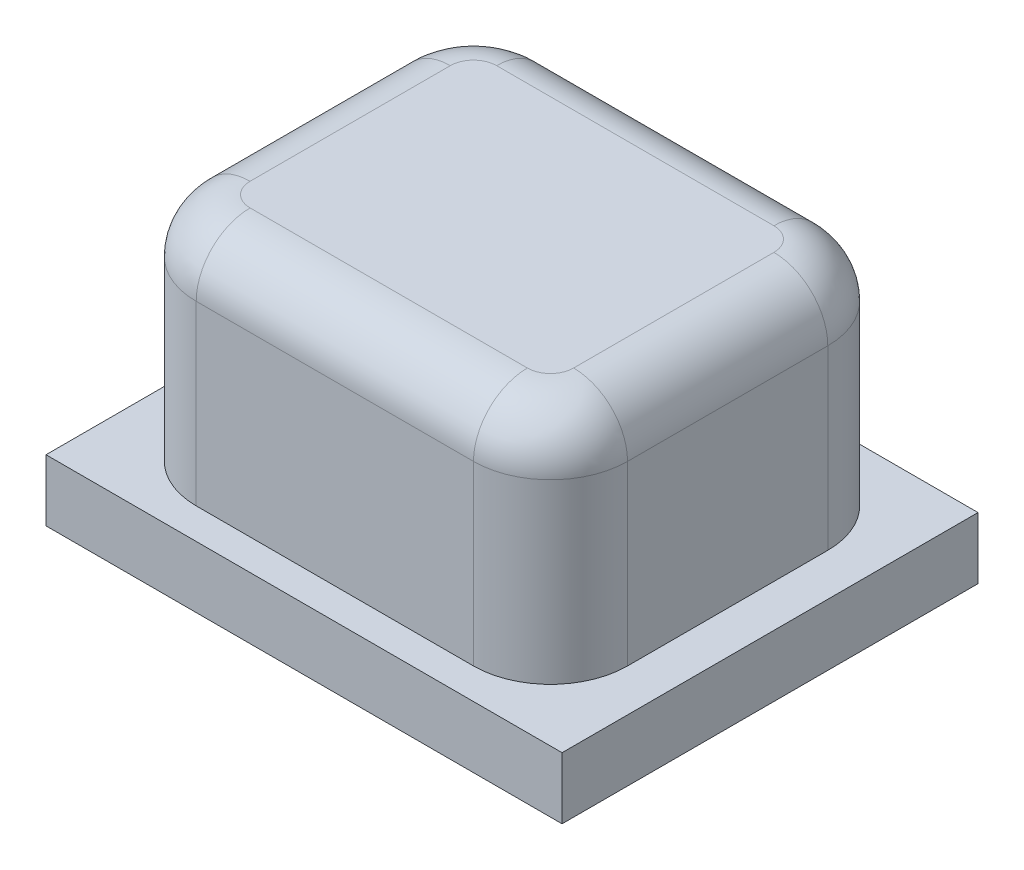
ISO-10303-21;
HEADER;
FILE_DESCRIPTION(('STEP AP214'),'2;1');
FILE_NAME('part.step','',(''),(''),'','','');
FILE_SCHEMA(('AUTOMOTIVE_DESIGN { 1 0 10303 214 1 1 1 1 }'));
ENDSEC;
DATA;
#1=APPLICATION_CONTEXT('core data for automotive mechanical design processes');
#2=APPLICATION_PROTOCOL_DEFINITION('international standard','automotive_design',2000,#1);
#3=PRODUCT_CONTEXT('',#1,'mechanical');
#4=PRODUCT('Part','Part','',(#3));
#5=PRODUCT_RELATED_PRODUCT_CATEGORY('part','',(#4));
#6=PRODUCT_DEFINITION_FORMATION('','',#4);
#7=PRODUCT_DEFINITION_CONTEXT('part definition',#1,'design');
#8=PRODUCT_DEFINITION('design','',#6,#7);
#9=PRODUCT_DEFINITION_SHAPE('','',#8);
#10=(LENGTH_UNIT() NAMED_UNIT(*) SI_UNIT(.MILLI.,.METRE.));
#11=(NAMED_UNIT(*) PLANE_ANGLE_UNIT() SI_UNIT($,.RADIAN.));
#12=(NAMED_UNIT(*) SI_UNIT($,.STERADIAN.) SOLID_ANGLE_UNIT());
#13=UNCERTAINTY_MEASURE_WITH_UNIT(LENGTH_MEASURE(1.E-05),#10,'distance_accuracy_value','');
#14=(GEOMETRIC_REPRESENTATION_CONTEXT(3) GLOBAL_UNCERTAINTY_ASSIGNED_CONTEXT((#13)) GLOBAL_UNIT_ASSIGNED_CONTEXT((#10,
#11,#12)) REPRESENTATION_CONTEXT('',''));
#15=CARTESIAN_POINT('',(0.,0.,0.));
#16=DIRECTION('',(0.,0.,1.));
#17=DIRECTION('',(1.,0.,0.));
#18=AXIS2_PLACEMENT_3D('',#15,#16,#17);
#19=CARTESIAN_POINT('',(1.8,3.,1.3));
#20=DIRECTION('',(0.,-1.,0.));
#21=DIRECTION('',(0.,0.,-1.));
#22=AXIS2_PLACEMENT_3D('',#19,#20,#21);
#23=CYLINDRICAL_SURFACE('',#22,1.);
#24=DIRECTION('',(0.,-1.,0.));
#25=VECTOR('',#24,1.);
#26=CARTESIAN_POINT('',(2.8,3.,1.3));
#27=LINE('',#26,#25);
#28=CARTESIAN_POINT('',(2.8,2.3,1.3));
#29=VERTEX_POINT('',#28);
#30=CARTESIAN_POINT('',(2.8,0.,1.3));
#31=VERTEX_POINT('',#30);
#32=EDGE_CURVE('E281',#29,#31,#27,.T.);
#33=ORIENTED_EDGE('',*,*,#32,.F.);
#34=CARTESIAN_POINT('',(1.8,2.3,1.3));
#35=DIRECTION('',(0.,1.,0.));
#36=DIRECTION('',(0.,0.,1.));
#37=AXIS2_PLACEMENT_3D('',#34,#35,#36);
#38=CIRCLE('',#37,1.);
#39=CARTESIAN_POINT('',(1.8,2.3,2.3));
#40=VERTEX_POINT('',#39);
#41=EDGE_CURVE('E305',#29,#40,#38,.F.);
#42=ORIENTED_EDGE('',*,*,#41,.T.);
#43=DIRECTION('',(0.,-1.,0.));
#44=VECTOR('',#43,1.);
#45=CARTESIAN_POINT('',(1.8,3.,2.3));
#46=LINE('',#45,#44);
#47=CARTESIAN_POINT('',(1.8,0.,2.3));
#48=VERTEX_POINT('',#47);
#49=EDGE_CURVE('E267',#40,#48,#46,.T.);
#50=ORIENTED_EDGE('',*,*,#49,.T.);
#51=CARTESIAN_POINT('',(1.8,0.,1.3));
#52=DIRECTION('',(0.,1.,0.));
#53=DIRECTION('',(0.,0.,1.));
#54=AXIS2_PLACEMENT_3D('',#51,#52,#53);
#55=CIRCLE('',#54,1.);
#56=EDGE_CURVE('E243',#48,#31,#55,.T.);
#57=ORIENTED_EDGE('',*,*,#56,.T.);
#58=EDGE_LOOP('',(#33,#42,#50,#57));
#59=FACE_BOUND('',#58,.T.);
#60=ADVANCED_FACE('F33',(#59),#23,.T.);
#61=CARTESIAN_POINT('',(2.8,3.,1.3));
#62=DIRECTION('',(-1.,0.,0.));
#63=DIRECTION('',(0.,0.,1.));
#64=AXIS2_PLACEMENT_3D('',#61,#62,#63);
#65=PLANE('',#64);
#66=DIRECTION('',(0.,-1.,0.));
#67=VECTOR('',#66,1.);
#68=CARTESIAN_POINT('',(2.8,3.,-1.3));
#69=LINE('',#68,#67);
#70=CARTESIAN_POINT('',(2.8,2.3,-1.3));
#71=VERTEX_POINT('',#70);
#72=CARTESIAN_POINT('',(2.8,0.,-1.3));
#73=VERTEX_POINT('',#72);
#74=EDGE_CURVE('E279',#71,#73,#69,.T.);
#75=ORIENTED_EDGE('',*,*,#74,.F.);
#76=DIRECTION('',(0.,0.,-1.));
#77=VECTOR('',#76,1.);
#78=CARTESIAN_POINT('',(2.8,2.3,1.3));
#79=LINE('',#78,#77);
#80=EDGE_CURVE('E303',#71,#29,#79,.F.);
#81=ORIENTED_EDGE('',*,*,#80,.T.);
#82=ORIENTED_EDGE('',*,*,#32,.T.);
#83=DIRECTION('',(0.,0.,-1.));
#84=VECTOR('',#83,1.);
#85=CARTESIAN_POINT('',(2.8,0.,1.3));
#86=LINE('',#85,#84);
#87=EDGE_CURVE('E246',#31,#73,#86,.T.);
#88=ORIENTED_EDGE('',*,*,#87,.T.);
#89=EDGE_LOOP('',(#75,#81,#82,#88));
#90=FACE_BOUND('',#89,.T.);
#91=ADVANCED_FACE('F380',(#90),#65,.F.);
#92=CARTESIAN_POINT('',(1.8,3.,-1.3));
#93=DIRECTION('',(0.,-1.,0.));
#94=DIRECTION('',(0.,0.,-1.));
#95=AXIS2_PLACEMENT_3D('',#92,#93,#94);
#96=CYLINDRICAL_SURFACE('',#95,1.);
#97=DIRECTION('',(0.,-1.,0.));
#98=VECTOR('',#97,1.);
#99=CARTESIAN_POINT('',(1.8,3.,-2.3));
#100=LINE('',#99,#98);
#101=CARTESIAN_POINT('',(1.8,2.3,-2.3));
#102=VERTEX_POINT('',#101);
#103=CARTESIAN_POINT('',(1.8,0.,-2.3));
#104=VERTEX_POINT('',#103);
#105=EDGE_CURVE('E277',#102,#104,#100,.T.);
#106=ORIENTED_EDGE('',*,*,#105,.F.);
#107=CARTESIAN_POINT('',(1.8,2.3,-1.3));
#108=DIRECTION('',(0.,1.,0.));
#109=DIRECTION('',(0.,0.,1.));
#110=AXIS2_PLACEMENT_3D('',#107,#108,#109);
#111=CIRCLE('',#110,1.);
#112=EDGE_CURVE('E300',#102,#71,#111,.F.);
#113=ORIENTED_EDGE('',*,*,#112,.T.);
#114=ORIENTED_EDGE('',*,*,#74,.T.);
#115=CARTESIAN_POINT('',(1.8,0.,-1.3));
#116=DIRECTION('',(0.,1.,0.));
#117=DIRECTION('',(0.,0.,-1.));
#118=AXIS2_PLACEMENT_3D('',#115,#116,#117);
#119=CIRCLE('',#118,1.);
#120=EDGE_CURVE('E249',#73,#104,#119,.T.);
#121=ORIENTED_EDGE('',*,*,#120,.T.);
#122=EDGE_LOOP('',(#106,#113,#114,#121));
#123=FACE_BOUND('',#122,.T.);
#124=ADVANCED_FACE('F377',(#123),#96,.T.);
#125=CARTESIAN_POINT('',(-1.8,3.,-2.3));
#126=DIRECTION('',(0.,0.,1.));
#127=DIRECTION('',(1.,0.,0.));
#128=AXIS2_PLACEMENT_3D('',#125,#126,#127);
#129=PLANE('',#128);
#130=DIRECTION('',(0.,-1.,0.));
#131=VECTOR('',#130,1.);
#132=CARTESIAN_POINT('',(-1.8,3.,-2.3));
#133=LINE('',#132,#131);
#134=CARTESIAN_POINT('',(-1.8,2.3,-2.3));
#135=VERTEX_POINT('',#134);
#136=CARTESIAN_POINT('',(-1.8,0.,-2.3));
#137=VERTEX_POINT('',#136);
#138=EDGE_CURVE('E275',#135,#137,#133,.T.);
#139=ORIENTED_EDGE('',*,*,#138,.F.);
#140=DIRECTION('',(-1.,0.,0.));
#141=VECTOR('',#140,1.);
#142=CARTESIAN_POINT('',(1.8,2.3,-2.3));
#143=LINE('',#142,#141);
#144=EDGE_CURVE('E11',#135,#102,#143,.F.);
#145=ORIENTED_EDGE('',*,*,#144,.T.);
#146=ORIENTED_EDGE('',*,*,#105,.T.);
#147=DIRECTION('',(-1.,0.,0.));
#148=VECTOR('',#147,1.);
#149=CARTESIAN_POINT('',(-1.8,0.,-2.3));
#150=LINE('',#149,#148);
#151=EDGE_CURVE('E252',#104,#137,#150,.T.);
#152=ORIENTED_EDGE('',*,*,#151,.T.);
#153=EDGE_LOOP('',(#139,#145,#146,#152));
#154=FACE_BOUND('',#153,.T.);
#155=ADVANCED_FACE('F359',(#154),#129,.F.);
#156=CARTESIAN_POINT('',(-1.8,3.,-1.3));
#157=DIRECTION('',(0.,-1.,0.));
#158=DIRECTION('',(0.,0.,-1.));
#159=AXIS2_PLACEMENT_3D('',#156,#157,#158);
#160=CYLINDRICAL_SURFACE('',#159,1.);
#161=DIRECTION('',(0.,-1.,0.));
#162=VECTOR('',#161,1.);
#163=CARTESIAN_POINT('',(-2.8,3.,-1.3));
#164=LINE('',#163,#162);
#165=CARTESIAN_POINT('',(-2.8,2.3,-1.3));
#166=VERTEX_POINT('',#165);
#167=CARTESIAN_POINT('',(-2.8,0.,-1.3));
#168=VERTEX_POINT('',#167);
#169=EDGE_CURVE('E273',#166,#168,#164,.T.);
#170=ORIENTED_EDGE('',*,*,#169,.F.);
#171=CARTESIAN_POINT('',(-1.8,2.3,-1.3));
#172=DIRECTION('',(0.,1.,0.));
#173=DIRECTION('',(0.,0.,1.));
#174=AXIS2_PLACEMENT_3D('',#171,#172,#173);
#175=CIRCLE('',#174,1.);
#176=EDGE_CURVE('E42',#166,#135,#175,.F.);
#177=ORIENTED_EDGE('',*,*,#176,.T.);
#178=ORIENTED_EDGE('',*,*,#138,.T.);
#179=CARTESIAN_POINT('',(-1.8,0.,-1.3));
#180=DIRECTION('',(0.,1.,0.));
#181=DIRECTION('',(0.,0.,-1.));
#182=AXIS2_PLACEMENT_3D('',#179,#180,#181);
#183=CIRCLE('',#182,1.);
#184=EDGE_CURVE('E255',#137,#168,#183,.T.);
#185=ORIENTED_EDGE('',*,*,#184,.T.);
#186=EDGE_LOOP('',(#170,#177,#178,#185));
#187=FACE_BOUND('',#186,.T.);
#188=ADVANCED_FACE('F355',(#187),#160,.T.);
#189=CARTESIAN_POINT('',(-2.8,3.,1.3));
#190=DIRECTION('',(1.,0.,0.));
#191=DIRECTION('',(0.,0.,-1.));
#192=AXIS2_PLACEMENT_3D('',#189,#190,#191);
#193=PLANE('',#192);
#194=DIRECTION('',(0.,-1.,0.));
#195=VECTOR('',#194,1.);
#196=CARTESIAN_POINT('',(-2.8,3.,1.3));
#197=LINE('',#196,#195);
#198=CARTESIAN_POINT('',(-2.8,2.3,1.3));
#199=VERTEX_POINT('',#198);
#200=CARTESIAN_POINT('',(-2.8,0.,1.3));
#201=VERTEX_POINT('',#200);
#202=EDGE_CURVE('E271',#199,#201,#197,.T.);
#203=ORIENTED_EDGE('',*,*,#202,.F.);
#204=DIRECTION('',(0.,0.,1.));
#205=VECTOR('',#204,1.);
#206=CARTESIAN_POINT('',(-2.8,2.3,-1.3));
#207=LINE('',#206,#205);
#208=EDGE_CURVE('E57',#199,#166,#207,.F.);
#209=ORIENTED_EDGE('',*,*,#208,.T.);
#210=ORIENTED_EDGE('',*,*,#169,.T.);
#211=DIRECTION('',(0.,0.,1.));
#212=VECTOR('',#211,1.);
#213=CARTESIAN_POINT('',(-2.8,0.,1.3));
#214=LINE('',#213,#212);
#215=EDGE_CURVE('E258',#168,#201,#214,.T.);
#216=ORIENTED_EDGE('',*,*,#215,.T.);
#217=EDGE_LOOP('',(#203,#209,#210,#216));
#218=FACE_BOUND('',#217,.T.);
#219=ADVANCED_FACE('F347',(#218),#193,.F.);
#220=CARTESIAN_POINT('',(-1.8,3.,1.3));
#221=DIRECTION('',(0.,-1.,0.));
#222=DIRECTION('',(0.,0.,-1.));
#223=AXIS2_PLACEMENT_3D('',#220,#221,#222);
#224=CYLINDRICAL_SURFACE('',#223,1.);
#225=DIRECTION('',(0.,-1.,0.));
#226=VECTOR('',#225,1.);
#227=CARTESIAN_POINT('',(-1.8,3.,2.3));
#228=LINE('',#227,#226);
#229=CARTESIAN_POINT('',(-1.8,2.3,2.3));
#230=VERTEX_POINT('',#229);
#231=CARTESIAN_POINT('',(-1.8,0.,2.3));
#232=VERTEX_POINT('',#231);
#233=EDGE_CURVE('E269',#230,#232,#228,.T.);
#234=ORIENTED_EDGE('',*,*,#233,.F.);
#235=CARTESIAN_POINT('',(-1.8,2.3,1.3));
#236=DIRECTION('',(0.,1.,0.));
#237=DIRECTION('',(0.,0.,1.));
#238=AXIS2_PLACEMENT_3D('',#235,#236,#237);
#239=CIRCLE('',#238,1.);
#240=EDGE_CURVE('E309',#230,#199,#239,.F.);
#241=ORIENTED_EDGE('',*,*,#240,.T.);
#242=ORIENTED_EDGE('',*,*,#202,.T.);
#243=CARTESIAN_POINT('',(-1.8,0.,1.3));
#244=DIRECTION('',(0.,1.,0.));
#245=DIRECTION('',(0.,0.,-1.));
#246=AXIS2_PLACEMENT_3D('',#243,#244,#245);
#247=CIRCLE('',#246,1.);
#248=EDGE_CURVE('E261',#201,#232,#247,.T.);
#249=ORIENTED_EDGE('',*,*,#248,.T.);
#250=EDGE_LOOP('',(#234,#241,#242,#249));
#251=FACE_BOUND('',#250,.T.);
#252=ADVANCED_FACE('F345',(#251),#224,.T.);
#253=CARTESIAN_POINT('',(-1.8,3.,2.3));
#254=DIRECTION('',(0.,0.,-1.));
#255=DIRECTION('',(-1.,0.,0.));
#256=AXIS2_PLACEMENT_3D('',#253,#254,#255);
#257=PLANE('',#256);
#258=ORIENTED_EDGE('',*,*,#49,.F.);
#259=DIRECTION('',(1.,0.,0.));
#260=VECTOR('',#259,1.);
#261=CARTESIAN_POINT('',(-1.8,2.3,2.3));
#262=LINE('',#261,#260);
#263=EDGE_CURVE('E307',#40,#230,#262,.F.);
#264=ORIENTED_EDGE('',*,*,#263,.T.);
#265=ORIENTED_EDGE('',*,*,#233,.T.);
#266=DIRECTION('',(1.,0.,0.));
#267=VECTOR('',#266,1.);
#268=CARTESIAN_POINT('',(-1.8,0.,2.3));
#269=LINE('',#268,#267);
#270=EDGE_CURVE('E264',#232,#48,#269,.T.);
#271=ORIENTED_EDGE('',*,*,#270,.T.);
#272=EDGE_LOOP('',(#258,#264,#265,#271));
#273=FACE_BOUND('',#272,.T.);
#274=ADVANCED_FACE('F387',(#273),#257,.F.);
#275=CARTESIAN_POINT('',(1.8,3.,1.3));
#276=DIRECTION('',(0.,1.,0.));
#277=DIRECTION('',(0.,0.,1.));
#278=AXIS2_PLACEMENT_3D('',#275,#276,#277);
#279=PLANE('',#278);
#280=DIRECTION('',(0.,0.,-1.));
#281=VECTOR('',#280,1.);
#282=CARTESIAN_POINT('',(2.1,3.,-1.3));
#283=LINE('',#282,#281);
#284=CARTESIAN_POINT('',(2.1,3.,1.3));
#285=VERTEX_POINT('',#284);
#286=CARTESIAN_POINT('',(2.1,3.,-1.3));
#287=VERTEX_POINT('',#286);
#288=EDGE_CURVE('E295',#285,#287,#283,.T.);
#289=ORIENTED_EDGE('',*,*,#288,.T.);
#290=CARTESIAN_POINT('',(1.8,3.,-1.3));
#291=DIRECTION('',(0.,1.,0.));
#292=DIRECTION('',(0.,0.,1.));
#293=AXIS2_PLACEMENT_3D('',#290,#291,#292);
#294=CIRCLE('',#293,0.3);
#295=CARTESIAN_POINT('',(1.8,3.,-1.6));
#296=VERTEX_POINT('',#295);
#297=EDGE_CURVE('E297',#287,#296,#294,.T.);
#298=ORIENTED_EDGE('',*,*,#297,.T.);
#299=DIRECTION('',(-1.,0.,0.));
#300=VECTOR('',#299,1.);
#301=CARTESIAN_POINT('',(-1.8,3.,-1.6));
#302=LINE('',#301,#300);
#303=CARTESIAN_POINT('',(-1.8,3.,-1.6));
#304=VERTEX_POINT('',#303);
#305=EDGE_CURVE('E283',#296,#304,#302,.T.);
#306=ORIENTED_EDGE('',*,*,#305,.T.);
#307=CARTESIAN_POINT('',(-1.8,3.,-1.3));
#308=DIRECTION('',(0.,1.,0.));
#309=DIRECTION('',(0.,0.,1.));
#310=AXIS2_PLACEMENT_3D('',#307,#308,#309);
#311=CIRCLE('',#310,0.3);
#312=CARTESIAN_POINT('',(-2.1,3.,-1.3));
#313=VERTEX_POINT('',#312);
#314=EDGE_CURVE('E285',#304,#313,#311,.T.);
#315=ORIENTED_EDGE('',*,*,#314,.T.);
#316=DIRECTION('',(0.,0.,1.));
#317=VECTOR('',#316,1.);
#318=CARTESIAN_POINT('',(-2.1,3.,1.3));
#319=LINE('',#318,#317);
#320=CARTESIAN_POINT('',(-2.1,3.,1.3));
#321=VERTEX_POINT('',#320);
#322=EDGE_CURVE('E287',#313,#321,#319,.T.);
#323=ORIENTED_EDGE('',*,*,#322,.T.);
#324=CARTESIAN_POINT('',(-1.8,3.,1.3));
#325=DIRECTION('',(0.,1.,0.));
#326=DIRECTION('',(0.,0.,1.));
#327=AXIS2_PLACEMENT_3D('',#324,#325,#326);
#328=CIRCLE('',#327,0.3);
#329=CARTESIAN_POINT('',(-1.8,3.,1.6));
#330=VERTEX_POINT('',#329);
#331=EDGE_CURVE('E289',#321,#330,#328,.T.);
#332=ORIENTED_EDGE('',*,*,#331,.T.);
#333=DIRECTION('',(1.,0.,0.));
#334=VECTOR('',#333,1.);
#335=CARTESIAN_POINT('',(1.8,3.,1.6));
#336=LINE('',#335,#334);
#337=CARTESIAN_POINT('',(1.8,3.,1.6));
#338=VERTEX_POINT('',#337);
#339=EDGE_CURVE('E291',#330,#338,#336,.T.);
#340=ORIENTED_EDGE('',*,*,#339,.T.);
#341=CARTESIAN_POINT('',(1.8,3.,1.3));
#342=DIRECTION('',(0.,1.,0.));
#343=DIRECTION('',(0.,0.,1.));
#344=AXIS2_PLACEMENT_3D('',#341,#342,#343);
#345=CIRCLE('',#344,0.3);
#346=EDGE_CURVE('E293',#338,#285,#345,.T.);
#347=ORIENTED_EDGE('',*,*,#346,.T.);
#348=EDGE_LOOP('',(#289,#298,#306,#315,#323,#332,#340,#347));
#349=FACE_BOUND('',#348,.T.);
#350=ADVANCED_FACE('F389',(#349),#279,.T.);
#351=CARTESIAN_POINT('',(0.,0.,0.));
#352=DIRECTION('',(0.,1.,0.));
#353=DIRECTION('',(0.,0.,1.));
#354=AXIS2_PLACEMENT_3D('',#351,#352,#353);
#355=PLANE('',#354);
#356=DIRECTION('',(0.,0.,1.));
#357=VECTOR('',#356,1.);
#358=CARTESIAN_POINT('',(3.35,0.,-2.7));
#359=LINE('',#358,#357);
#360=CARTESIAN_POINT('',(3.35,0.,-2.7));
#361=VERTEX_POINT('',#360);
#362=CARTESIAN_POINT('',(3.35,0.,2.7));
#363=VERTEX_POINT('',#362);
#364=EDGE_CURVE('E210',#361,#363,#359,.T.);
#365=ORIENTED_EDGE('',*,*,#364,.F.);
#366=DIRECTION('',(1.,0.,0.));
#367=VECTOR('',#366,1.);
#368=CARTESIAN_POINT('',(-3.35,0.,-2.7));
#369=LINE('',#368,#367);
#370=CARTESIAN_POINT('',(-3.35,0.,-2.7));
#371=VERTEX_POINT('',#370);
#372=EDGE_CURVE('E218',#371,#361,#369,.T.);
#373=ORIENTED_EDGE('',*,*,#372,.F.);
#374=DIRECTION('',(0.,0.,-1.));
#375=VECTOR('',#374,1.);
#376=CARTESIAN_POINT('',(-3.35,0.,-2.7));
#377=LINE('',#376,#375);
#378=CARTESIAN_POINT('',(-3.35,0.,2.7));
#379=VERTEX_POINT('',#378);
#380=EDGE_CURVE('E229',#379,#371,#377,.T.);
#381=ORIENTED_EDGE('',*,*,#380,.F.);
#382=DIRECTION('',(-1.,0.,0.));
#383=VECTOR('',#382,1.);
#384=CARTESIAN_POINT('',(-3.35,0.,2.7));
#385=LINE('',#384,#383);
#386=EDGE_CURVE('E227',#363,#379,#385,.T.);
#387=ORIENTED_EDGE('',*,*,#386,.F.);
#388=EDGE_LOOP('',(#365,#373,#381,#387));
#389=FACE_BOUND('',#388,.T.);
#390=ORIENTED_EDGE('',*,*,#56,.F.);
#391=ORIENTED_EDGE('',*,*,#270,.F.);
#392=ORIENTED_EDGE('',*,*,#248,.F.);
#393=ORIENTED_EDGE('',*,*,#215,.F.);
#394=ORIENTED_EDGE('',*,*,#184,.F.);
#395=ORIENTED_EDGE('',*,*,#151,.F.);
#396=ORIENTED_EDGE('',*,*,#120,.F.);
#397=ORIENTED_EDGE('',*,*,#87,.F.);
#398=EDGE_LOOP('',(#390,#391,#392,#393,#394,#395,#396,#397));
#399=FACE_BOUND('',#398,.T.);
#400=ADVANCED_FACE('F352',(#389,#399),#355,.T.);
#401=CARTESIAN_POINT('',(3.35,-0.8,-2.7));
#402=DIRECTION('',(-1.,0.,0.));
#403=DIRECTION('',(0.,0.,1.));
#404=AXIS2_PLACEMENT_3D('',#401,#402,#403);
#405=PLANE('',#404);
#406=ORIENTED_EDGE('',*,*,#364,.T.);
#407=DIRECTION('',(0.,1.,0.));
#408=VECTOR('',#407,1.);
#409=CARTESIAN_POINT('',(3.35,-0.8,2.7));
#410=LINE('',#409,#408);
#411=CARTESIAN_POINT('',(3.35,-0.8,2.7));
#412=VERTEX_POINT('',#411);
#413=EDGE_CURVE('E240',#412,#363,#410,.T.);
#414=ORIENTED_EDGE('',*,*,#413,.F.);
#415=DIRECTION('',(0.,0.,1.));
#416=VECTOR('',#415,1.);
#417=CARTESIAN_POINT('',(3.35,-0.8,-2.7));
#418=LINE('',#417,#416);
#419=CARTESIAN_POINT('',(3.35,-0.8,-2.7));
#420=VERTEX_POINT('',#419);
#421=EDGE_CURVE('E214',#420,#412,#418,.T.);
#422=ORIENTED_EDGE('',*,*,#421,.F.);
#423=DIRECTION('',(0.,1.,0.));
#424=VECTOR('',#423,1.);
#425=CARTESIAN_POINT('',(3.35,-0.8,-2.7));
#426=LINE('',#425,#424);
#427=EDGE_CURVE('E224',#420,#361,#426,.T.);
#428=ORIENTED_EDGE('',*,*,#427,.T.);
#429=EDGE_LOOP('',(#406,#414,#422,#428));
#430=FACE_BOUND('',#429,.T.);
#431=ADVANCED_FACE('F452',(#430),#405,.F.);
#432=CARTESIAN_POINT('',(-3.35,-0.8,2.7));
#433=DIRECTION('',(0.,0.,-1.));
#434=DIRECTION('',(-1.,0.,0.));
#435=AXIS2_PLACEMENT_3D('',#432,#433,#434);
#436=PLANE('',#435);
#437=ORIENTED_EDGE('',*,*,#386,.T.);
#438=DIRECTION('',(0.,1.,0.));
#439=VECTOR('',#438,1.);
#440=CARTESIAN_POINT('',(-3.35,-0.8,2.7));
#441=LINE('',#440,#439);
#442=CARTESIAN_POINT('',(-3.35,-0.8,2.7));
#443=VERTEX_POINT('',#442);
#444=EDGE_CURVE('E237',#443,#379,#441,.T.);
#445=ORIENTED_EDGE('',*,*,#444,.F.);
#446=DIRECTION('',(-1.,0.,0.));
#447=VECTOR('',#446,1.);
#448=CARTESIAN_POINT('',(-3.35,-0.8,2.7));
#449=LINE('',#448,#447);
#450=EDGE_CURVE('E217',#412,#443,#449,.T.);
#451=ORIENTED_EDGE('',*,*,#450,.F.);
#452=ORIENTED_EDGE('',*,*,#413,.T.);
#453=EDGE_LOOP('',(#437,#445,#451,#452));
#454=FACE_BOUND('',#453,.T.);
#455=ADVANCED_FACE('F460',(#454),#436,.F.);
#456=CARTESIAN_POINT('',(-3.35,-0.8,-2.7));
#457=DIRECTION('',(1.,0.,0.));
#458=DIRECTION('',(0.,0.,-1.));
#459=AXIS2_PLACEMENT_3D('',#456,#457,#458);
#460=PLANE('',#459);
#461=ORIENTED_EDGE('',*,*,#380,.T.);
#462=DIRECTION('',(0.,1.,0.));
#463=VECTOR('',#462,1.);
#464=CARTESIAN_POINT('',(-3.35,-0.8,-2.7));
#465=LINE('',#464,#463);
#466=CARTESIAN_POINT('',(-3.35,-0.8,-2.7));
#467=VERTEX_POINT('',#466);
#468=EDGE_CURVE('E234',#467,#371,#465,.T.);
#469=ORIENTED_EDGE('',*,*,#468,.F.);
#470=DIRECTION('',(0.,0.,-1.));
#471=VECTOR('',#470,1.);
#472=CARTESIAN_POINT('',(-3.35,-0.8,-2.7));
#473=LINE('',#472,#471);
#474=EDGE_CURVE('E220',#443,#467,#473,.T.);
#475=ORIENTED_EDGE('',*,*,#474,.F.);
#476=ORIENTED_EDGE('',*,*,#444,.T.);
#477=EDGE_LOOP('',(#461,#469,#475,#476));
#478=FACE_BOUND('',#477,.T.);
#479=ADVANCED_FACE('F456',(#478),#460,.F.);
#480=CARTESIAN_POINT('',(-3.35,-0.8,-2.7));
#481=DIRECTION('',(0.,0.,1.));
#482=DIRECTION('',(1.,0.,0.));
#483=AXIS2_PLACEMENT_3D('',#480,#481,#482);
#484=PLANE('',#483);
#485=ORIENTED_EDGE('',*,*,#372,.T.);
#486=ORIENTED_EDGE('',*,*,#427,.F.);
#487=DIRECTION('',(1.,0.,0.));
#488=VECTOR('',#487,1.);
#489=CARTESIAN_POINT('',(-3.35,-0.8,-2.7));
#490=LINE('',#489,#488);
#491=EDGE_CURVE('E222',#467,#420,#490,.T.);
#492=ORIENTED_EDGE('',*,*,#491,.F.);
#493=ORIENTED_EDGE('',*,*,#468,.T.);
#494=EDGE_LOOP('',(#485,#486,#492,#493));
#495=FACE_BOUND('',#494,.T.);
#496=ADVANCED_FACE('F448',(#495),#484,.F.);
#497=CARTESIAN_POINT('',(0.,-0.8,0.));
#498=DIRECTION('',(0.,1.,0.));
#499=DIRECTION('',(0.,0.,1.));
#500=AXIS2_PLACEMENT_3D('',#497,#498,#499);
#501=PLANE('',#500);
#502=DIRECTION('',(-1.,0.,0.));
#503=VECTOR('',#502,1.);
#504=CARTESIAN_POINT('',(-1.8,-0.8,1.8));
#505=LINE('',#504,#503);
#506=CARTESIAN_POINT('',(1.8,-0.8,1.8));
#507=VERTEX_POINT('',#506);
#508=CARTESIAN_POINT('',(-1.8,-0.8,1.8));
#509=VERTEX_POINT('',#508);
#510=EDGE_CURVE('E204',#507,#509,#505,.T.);
#511=ORIENTED_EDGE('',*,*,#510,.F.);
#512=DIRECTION('',(0.,0.,1.));
#513=VECTOR('',#512,1.);
#514=CARTESIAN_POINT('',(1.8,-0.8,-1.8));
#515=LINE('',#514,#513);
#516=CARTESIAN_POINT('',(1.8,-0.8,-1.8));
#517=VERTEX_POINT('',#516);
#518=EDGE_CURVE('E178',#517,#507,#515,.T.);
#519=ORIENTED_EDGE('',*,*,#518,.F.);
#520=DIRECTION('',(1.,0.,0.));
#521=VECTOR('',#520,1.);
#522=CARTESIAN_POINT('',(-1.8,-0.8,-1.8));
#523=LINE('',#522,#521);
#524=CARTESIAN_POINT('',(-1.8,-0.8,-1.8));
#525=VERTEX_POINT('',#524);
#526=EDGE_CURVE('E195',#525,#517,#523,.T.);
#527=ORIENTED_EDGE('',*,*,#526,.F.);
#528=DIRECTION('',(0.,0.,-1.));
#529=VECTOR('',#528,1.);
#530=CARTESIAN_POINT('',(-1.8,-0.8,-1.8));
#531=LINE('',#530,#529);
#532=EDGE_CURVE('E198',#509,#525,#531,.T.);
#533=ORIENTED_EDGE('',*,*,#532,.F.);
#534=EDGE_LOOP('',(#511,#519,#527,#533));
#535=FACE_BOUND('',#534,.T.);
#536=ORIENTED_EDGE('',*,*,#421,.T.);
#537=ORIENTED_EDGE('',*,*,#450,.T.);
#538=ORIENTED_EDGE('',*,*,#474,.T.);
#539=ORIENTED_EDGE('',*,*,#491,.T.);
#540=EDGE_LOOP('',(#536,#537,#538,#539));
#541=FACE_BOUND('',#540,.T.);
#542=ADVANCED_FACE('F445',(#535,#541),#501,.F.);
#543=CARTESIAN_POINT('',(1.8,1.8,-1.8));
#544=DIRECTION('',(1.,0.,0.));
#545=DIRECTION('',(0.,0.,-1.));
#546=AXIS2_PLACEMENT_3D('',#543,#544,#545);
#547=PLANE('',#546);
#548=ORIENTED_EDGE('',*,*,#518,.T.);
#549=DIRECTION('',(0.,-1.,0.));
#550=VECTOR('',#549,1.);
#551=CARTESIAN_POINT('',(1.8,1.8,1.8));
#552=LINE('',#551,#550);
#553=CARTESIAN_POINT('',(1.8,1.8,1.8));
#554=VERTEX_POINT('',#553);
#555=EDGE_CURVE('E171',#554,#507,#552,.T.);
#556=ORIENTED_EDGE('',*,*,#555,.F.);
#557=DIRECTION('',(0.,0.,1.));
#558=VECTOR('',#557,1.);
#559=CARTESIAN_POINT('',(1.8,1.8,-1.8));
#560=LINE('',#559,#558);
#561=CARTESIAN_POINT('',(1.8,1.8,-1.8));
#562=VERTEX_POINT('',#561);
#563=EDGE_CURVE('E175',#562,#554,#560,.T.);
#564=ORIENTED_EDGE('',*,*,#563,.F.);
#565=DIRECTION('',(0.,-1.,0.));
#566=VECTOR('',#565,1.);
#567=CARTESIAN_POINT('',(1.8,1.8,-1.8));
#568=LINE('',#567,#566);
#569=EDGE_CURVE('E208',#562,#517,#568,.T.);
#570=ORIENTED_EDGE('',*,*,#569,.T.);
#571=EDGE_LOOP('',(#548,#556,#564,#570));
#572=FACE_BOUND('',#571,.T.);
#573=ADVANCED_FACE('F173',(#572),#547,.F.);
#574=CARTESIAN_POINT('',(-1.8,1.8,-1.8));
#575=DIRECTION('',(0.,0.,-1.));
#576=DIRECTION('',(-1.,0.,0.));
#577=AXIS2_PLACEMENT_3D('',#574,#575,#576);
#578=PLANE('',#577);
#579=ORIENTED_EDGE('',*,*,#526,.T.);
#580=ORIENTED_EDGE('',*,*,#569,.F.);
#581=DIRECTION('',(1.,0.,0.));
#582=VECTOR('',#581,1.);
#583=CARTESIAN_POINT('',(-1.8,1.8,-1.8));
#584=LINE('',#583,#582);
#585=CARTESIAN_POINT('',(-1.8,1.8,-1.8));
#586=VERTEX_POINT('',#585);
#587=EDGE_CURVE('E183',#586,#562,#584,.T.);
#588=ORIENTED_EDGE('',*,*,#587,.F.);
#589=DIRECTION('',(0.,-1.,0.));
#590=VECTOR('',#589,1.);
#591=CARTESIAN_POINT('',(-1.8,1.8,-1.8));
#592=LINE('',#591,#590);
#593=EDGE_CURVE('E211',#586,#525,#592,.T.);
#594=ORIENTED_EDGE('',*,*,#593,.T.);
#595=EDGE_LOOP('',(#579,#580,#588,#594));
#596=FACE_BOUND('',#595,.T.);
#597=ADVANCED_FACE('F436',(#596),#578,.F.);
#598=CARTESIAN_POINT('',(-1.8,1.8,-1.8));
#599=DIRECTION('',(-1.,0.,0.));
#600=DIRECTION('',(0.,0.,1.));
#601=AXIS2_PLACEMENT_3D('',#598,#599,#600);
#602=PLANE('',#601);
#603=ORIENTED_EDGE('',*,*,#532,.T.);
#604=ORIENTED_EDGE('',*,*,#593,.F.);
#605=DIRECTION('',(0.,0.,-1.));
#606=VECTOR('',#605,1.);
#607=CARTESIAN_POINT('',(-1.8,1.8,-1.8));
#608=LINE('',#607,#606);
#609=CARTESIAN_POINT('',(-1.8,1.8,1.8));
#610=VERTEX_POINT('',#609);
#611=EDGE_CURVE('E191',#610,#586,#608,.T.);
#612=ORIENTED_EDGE('',*,*,#611,.F.);
#613=DIRECTION('',(0.,-1.,0.));
#614=VECTOR('',#613,1.);
#615=CARTESIAN_POINT('',(-1.8,1.8,1.8));
#616=LINE('',#615,#614);
#617=EDGE_CURVE('E182',#610,#509,#616,.T.);
#618=ORIENTED_EDGE('',*,*,#617,.T.);
#619=EDGE_LOOP('',(#603,#604,#612,#618));
#620=FACE_BOUND('',#619,.T.);
#621=ADVANCED_FACE('F433',(#620),#602,.F.);
#622=CARTESIAN_POINT('',(-1.8,1.8,1.8));
#623=DIRECTION('',(0.,0.,1.));
#624=DIRECTION('',(1.,0.,0.));
#625=AXIS2_PLACEMENT_3D('',#622,#623,#624);
#626=PLANE('',#625);
#627=ORIENTED_EDGE('',*,*,#510,.T.);
#628=ORIENTED_EDGE('',*,*,#617,.F.);
#629=DIRECTION('',(-1.,0.,0.));
#630=VECTOR('',#629,1.);
#631=CARTESIAN_POINT('',(-1.8,1.8,1.8));
#632=LINE('',#631,#630);
#633=EDGE_CURVE('E186',#554,#610,#632,.T.);
#634=ORIENTED_EDGE('',*,*,#633,.F.);
#635=ORIENTED_EDGE('',*,*,#555,.T.);
#636=EDGE_LOOP('',(#627,#628,#634,#635));
#637=FACE_BOUND('',#636,.T.);
#638=ADVANCED_FACE('F187',(#637),#626,.F.);
#639=CARTESIAN_POINT('',(0.,1.8,0.));
#640=DIRECTION('',(0.,1.,0.));
#641=DIRECTION('',(0.,0.,1.));
#642=AXIS2_PLACEMENT_3D('',#639,#640,#641);
#643=PLANE('',#642);
#644=ORIENTED_EDGE('',*,*,#563,.T.);
#645=ORIENTED_EDGE('',*,*,#633,.T.);
#646=ORIENTED_EDGE('',*,*,#611,.T.);
#647=ORIENTED_EDGE('',*,*,#587,.T.);
#648=EDGE_LOOP('',(#644,#645,#646,#647));
#649=FACE_BOUND('',#648,.T.);
#650=ADVANCED_FACE('F193',(#649),#643,.F.);
#651=CARTESIAN_POINT('',(-1.8,2.3,1.3));
#652=DIRECTION('',(0.,1.,0.));
#653=DIRECTION('',(0.,0.,1.));
#654=AXIS2_PLACEMENT_3D('',#651,#652,#653);
#655=DEGENERATE_TOROIDAL_SURFACE('',#654,0.3,0.7,.T.);
#656=CARTESIAN_POINT('',(-2.1,2.3,1.3));
#657=DIRECTION('',(0.,0.,-1.));
#658=DIRECTION('',(-1.,0.,0.));
#659=AXIS2_PLACEMENT_3D('',#656,#657,#658);
#660=CIRCLE('',#659,0.7);
#661=EDGE_CURVE('E328',#199,#321,#660,.T.);
#662=ORIENTED_EDGE('',*,*,#661,.F.);
#663=ORIENTED_EDGE('',*,*,#240,.F.);
#664=CARTESIAN_POINT('',(-1.8,2.3,1.6));
#665=DIRECTION('',(1.,0.,0.));
#666=DIRECTION('',(0.,0.,-1.));
#667=AXIS2_PLACEMENT_3D('',#664,#665,#666);
#668=CIRCLE('',#667,0.7);
#669=EDGE_CURVE('E37',#330,#230,#668,.T.);
#670=ORIENTED_EDGE('',*,*,#669,.F.);
#671=ORIENTED_EDGE('',*,*,#331,.F.);
#672=EDGE_LOOP('',(#662,#663,#670,#671));
#673=FACE_BOUND('',#672,.T.);
#674=ADVANCED_FACE('F35',(#673),#655,.T.);
#675=CARTESIAN_POINT('',(1.8,2.3,1.6));
#676=DIRECTION('',(-1.,0.,0.));
#677=DIRECTION('',(0.,0.,1.));
#678=AXIS2_PLACEMENT_3D('',#675,#676,#677);
#679=CYLINDRICAL_SURFACE('',#678,0.7);
#680=ORIENTED_EDGE('',*,*,#669,.T.);
#681=ORIENTED_EDGE('',*,*,#263,.F.);
#682=CARTESIAN_POINT('',(1.8,2.3,1.6));
#683=DIRECTION('',(1.,0.,0.));
#684=DIRECTION('',(0.,0.,-1.));
#685=AXIS2_PLACEMENT_3D('',#682,#683,#684);
#686=CIRCLE('',#685,0.7);
#687=EDGE_CURVE('E326',#338,#40,#686,.T.);
#688=ORIENTED_EDGE('',*,*,#687,.F.);
#689=ORIENTED_EDGE('',*,*,#339,.F.);
#690=EDGE_LOOP('',(#680,#681,#688,#689));
#691=FACE_BOUND('',#690,.T.);
#692=ADVANCED_FACE('F338',(#691),#679,.T.);
#693=CARTESIAN_POINT('',(-2.1,2.3,1.3));
#694=DIRECTION('',(0.,0.,-1.));
#695=DIRECTION('',(-1.,0.,0.));
#696=AXIS2_PLACEMENT_3D('',#693,#694,#695);
#697=CYLINDRICAL_SURFACE('',#696,0.7);
#698=ORIENTED_EDGE('',*,*,#661,.T.);
#699=ORIENTED_EDGE('',*,*,#322,.F.);
#700=CARTESIAN_POINT('',(-2.1,2.3,-1.3));
#701=DIRECTION('',(0.,0.,-1.));
#702=DIRECTION('',(-1.,0.,0.));
#703=AXIS2_PLACEMENT_3D('',#700,#701,#702);
#704=CIRCLE('',#703,0.7);
#705=EDGE_CURVE('E323',#166,#313,#704,.T.);
#706=ORIENTED_EDGE('',*,*,#705,.F.);
#707=ORIENTED_EDGE('',*,*,#208,.F.);
#708=EDGE_LOOP('',(#698,#699,#706,#707));
#709=FACE_BOUND('',#708,.T.);
#710=ADVANCED_FACE('F419',(#709),#697,.T.);
#711=CARTESIAN_POINT('',(1.8,2.3,1.3));
#712=DIRECTION('',(0.,1.,0.));
#713=DIRECTION('',(0.,0.,1.));
#714=AXIS2_PLACEMENT_3D('',#711,#712,#713);
#715=DEGENERATE_TOROIDAL_SURFACE('',#714,0.3,0.7,.T.);
#716=ORIENTED_EDGE('',*,*,#687,.T.);
#717=ORIENTED_EDGE('',*,*,#41,.F.);
#718=CARTESIAN_POINT('',(2.1,2.3,1.3));
#719=DIRECTION('',(0.,0.,-1.));
#720=DIRECTION('',(-1.,0.,0.));
#721=AXIS2_PLACEMENT_3D('',#718,#719,#720);
#722=CIRCLE('',#721,0.7);
#723=EDGE_CURVE('E320',#285,#29,#722,.T.);
#724=ORIENTED_EDGE('',*,*,#723,.F.);
#725=ORIENTED_EDGE('',*,*,#346,.F.);
#726=EDGE_LOOP('',(#716,#717,#724,#725));
#727=FACE_BOUND('',#726,.T.);
#728=ADVANCED_FACE('F416',(#727),#715,.T.);
#729=CARTESIAN_POINT('',(-1.8,2.3,-1.3));
#730=DIRECTION('',(0.,1.,0.));
#731=DIRECTION('',(0.,0.,1.));
#732=AXIS2_PLACEMENT_3D('',#729,#730,#731);
#733=DEGENERATE_TOROIDAL_SURFACE('',#732,0.3,0.7,.T.);
#734=ORIENTED_EDGE('',*,*,#705,.T.);
#735=ORIENTED_EDGE('',*,*,#314,.F.);
#736=CARTESIAN_POINT('',(-1.8,2.3,-1.6));
#737=DIRECTION('',(1.,0.,0.));
#738=DIRECTION('',(0.,0.,-1.));
#739=AXIS2_PLACEMENT_3D('',#736,#737,#738);
#740=CIRCLE('',#739,0.7);
#741=EDGE_CURVE('E317',#135,#304,#740,.T.);
#742=ORIENTED_EDGE('',*,*,#741,.F.);
#743=ORIENTED_EDGE('',*,*,#176,.F.);
#744=EDGE_LOOP('',(#734,#735,#742,#743));
#745=FACE_BOUND('',#744,.T.);
#746=ADVANCED_FACE('F364',(#745),#733,.T.);
#747=CARTESIAN_POINT('',(2.1,2.3,1.3));
#748=DIRECTION('',(0.,0.,1.));
#749=DIRECTION('',(1.,0.,0.));
#750=AXIS2_PLACEMENT_3D('',#747,#748,#749);
#751=CYLINDRICAL_SURFACE('',#750,0.7);
#752=ORIENTED_EDGE('',*,*,#723,.T.);
#753=ORIENTED_EDGE('',*,*,#80,.F.);
#754=CARTESIAN_POINT('',(2.1,2.3,-1.3));
#755=DIRECTION('',(0.,0.,-1.));
#756=DIRECTION('',(-1.,0.,0.));
#757=AXIS2_PLACEMENT_3D('',#754,#755,#756);
#758=CIRCLE('',#757,0.7);
#759=EDGE_CURVE('E315',#287,#71,#758,.T.);
#760=ORIENTED_EDGE('',*,*,#759,.F.);
#761=ORIENTED_EDGE('',*,*,#288,.F.);
#762=EDGE_LOOP('',(#752,#753,#760,#761));
#763=FACE_BOUND('',#762,.T.);
#764=ADVANCED_FACE('F410',(#763),#751,.T.);
#765=CARTESIAN_POINT('',(1.8,2.3,-1.6));
#766=DIRECTION('',(1.,0.,0.));
#767=DIRECTION('',(0.,0.,-1.));
#768=AXIS2_PLACEMENT_3D('',#765,#766,#767);
#769=CYLINDRICAL_SURFACE('',#768,0.7);
#770=ORIENTED_EDGE('',*,*,#741,.T.);
#771=ORIENTED_EDGE('',*,*,#305,.F.);
#772=CARTESIAN_POINT('',(1.8,2.3,-1.6));
#773=DIRECTION('',(1.,0.,0.));
#774=DIRECTION('',(0.,0.,-1.));
#775=AXIS2_PLACEMENT_3D('',#772,#773,#774);
#776=CIRCLE('',#775,0.7);
#777=EDGE_CURVE('E313',#102,#296,#776,.T.);
#778=ORIENTED_EDGE('',*,*,#777,.F.);
#779=ORIENTED_EDGE('',*,*,#144,.F.);
#780=EDGE_LOOP('',(#770,#771,#778,#779));
#781=FACE_BOUND('',#780,.T.);
#782=ADVANCED_FACE('F368',(#781),#769,.T.);
#783=CARTESIAN_POINT('',(1.8,2.3,-1.3));
#784=DIRECTION('',(0.,1.,0.));
#785=DIRECTION('',(0.,0.,1.));
#786=AXIS2_PLACEMENT_3D('',#783,#784,#785);
#787=DEGENERATE_TOROIDAL_SURFACE('',#786,0.3,0.7,.T.);
#788=ORIENTED_EDGE('',*,*,#759,.T.);
#789=ORIENTED_EDGE('',*,*,#112,.F.);
#790=ORIENTED_EDGE('',*,*,#777,.T.);
#791=ORIENTED_EDGE('',*,*,#297,.F.);
#792=EDGE_LOOP('',(#788,#789,#790,#791));
#793=FACE_BOUND('',#792,.T.);
#794=ADVANCED_FACE('F372',(#793),#787,.T.);
#795=CLOSED_SHELL('',(#60,#91,#124,#155,#188,#219,#252,#274,#350,#400,#431,#455,#479,#496,#542,
#573,#597,#621,#638,#650,#674,#692,#710,#728,#746,#764,#782,#794));
#796=MANIFOLD_SOLID_BREP('B2',#795);
#797=ADVANCED_BREP_SHAPE_REPRESENTATION('',(#18,#796),#14);
#798=SHAPE_DEFINITION_REPRESENTATION(#9,#797);
ENDSEC;
END-ISO-10303-21;
